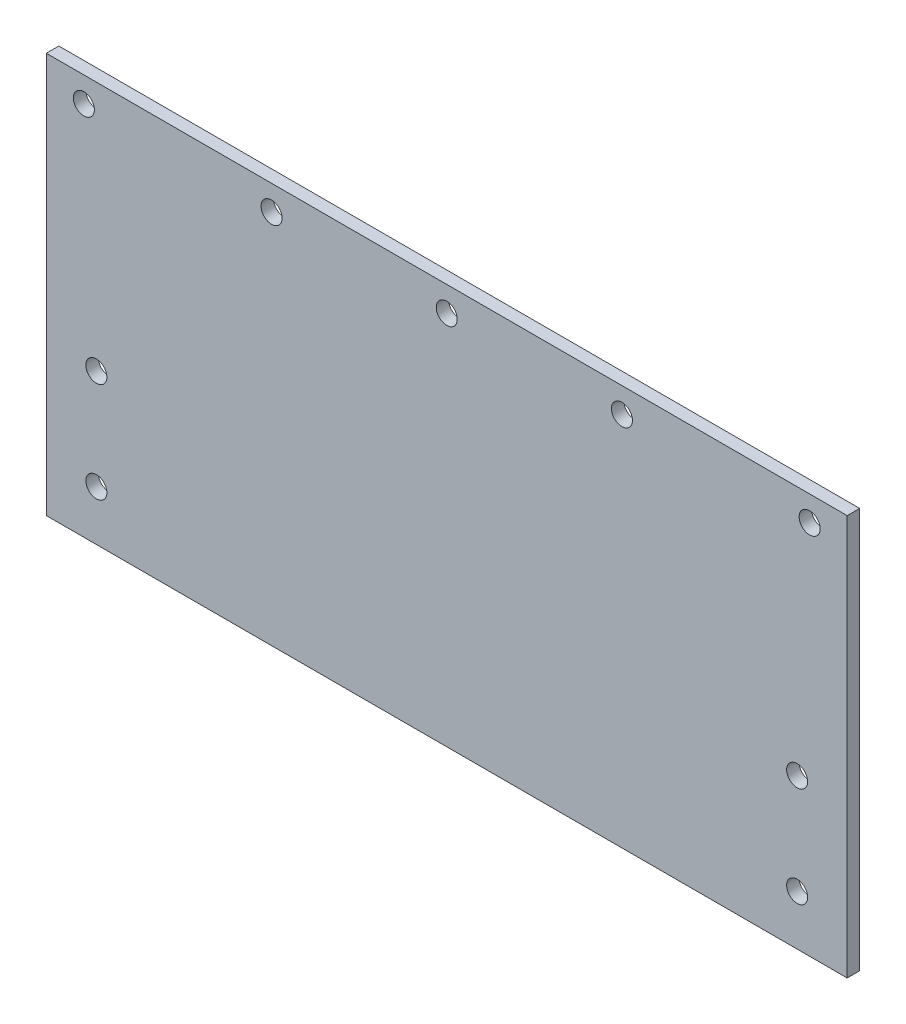
ISO-10303-21;
HEADER;
FILE_DESCRIPTION(('STEP AP214'),'2;1');
FILE_NAME('part.step','',(''),(''),'','','');
FILE_SCHEMA(('AUTOMOTIVE_DESIGN { 1 0 10303 214 1 1 1 1 }'));
ENDSEC;
DATA;
#1=APPLICATION_CONTEXT('core data for automotive mechanical design processes');
#2=APPLICATION_PROTOCOL_DEFINITION('international standard','automotive_design',2000,#1);
#3=PRODUCT_CONTEXT('',#1,'mechanical');
#4=PRODUCT('Part','Part','',(#3));
#5=PRODUCT_RELATED_PRODUCT_CATEGORY('part','',(#4));
#6=PRODUCT_DEFINITION_FORMATION('','',#4);
#7=PRODUCT_DEFINITION_CONTEXT('part definition',#1,'design');
#8=PRODUCT_DEFINITION('design','',#6,#7);
#9=PRODUCT_DEFINITION_SHAPE('','',#8);
#10=(LENGTH_UNIT() NAMED_UNIT(*) SI_UNIT(.MILLI.,.METRE.));
#11=(NAMED_UNIT(*) PLANE_ANGLE_UNIT() SI_UNIT($,.RADIAN.));
#12=(NAMED_UNIT(*) SI_UNIT($,.STERADIAN.) SOLID_ANGLE_UNIT());
#13=UNCERTAINTY_MEASURE_WITH_UNIT(LENGTH_MEASURE(1.E-05),#10,'distance_accuracy_value','');
#14=(GEOMETRIC_REPRESENTATION_CONTEXT(3) GLOBAL_UNCERTAINTY_ASSIGNED_CONTEXT((#13)) GLOBAL_UNIT_ASSIGNED_CONTEXT((#10,
#11,#12)) REPRESENTATION_CONTEXT('',''));
#15=CARTESIAN_POINT('',(0.,0.,0.));
#16=DIRECTION('',(0.,0.,1.));
#17=DIRECTION('',(1.,0.,0.));
#18=AXIS2_PLACEMENT_3D('',#15,#16,#17);
#19=CARTESIAN_POINT('',(160.,-80.,5.));
#20=DIRECTION('',(-1.,0.,0.));
#21=DIRECTION('',(0.,0.,1.));
#22=AXIS2_PLACEMENT_3D('',#19,#20,#21);
#23=PLANE('',#22);
#24=DIRECTION('',(0.,1.,0.));
#25=VECTOR('',#24,1.);
#26=CARTESIAN_POINT('',(160.,-80.,0.));
#27=LINE('',#26,#25);
#28=CARTESIAN_POINT('',(160.,-80.,0.));
#29=VERTEX_POINT('',#28);
#30=CARTESIAN_POINT('',(160.,80.,0.));
#31=VERTEX_POINT('',#30);
#32=EDGE_CURVE('E107',#29,#31,#27,.T.);
#33=ORIENTED_EDGE('',*,*,#32,.T.);
#34=DIRECTION('',(0.,0.,-1.));
#35=VECTOR('',#34,1.);
#36=CARTESIAN_POINT('',(160.,80.,5.));
#37=LINE('',#36,#35);
#38=CARTESIAN_POINT('',(160.,80.,5.));
#39=VERTEX_POINT('',#38);
#40=EDGE_CURVE('E11',#39,#31,#37,.T.);
#41=ORIENTED_EDGE('',*,*,#40,.F.);
#42=DIRECTION('',(0.,1.,0.));
#43=VECTOR('',#42,1.);
#44=CARTESIAN_POINT('',(160.,-80.,5.));
#45=LINE('',#44,#43);
#46=CARTESIAN_POINT('',(160.,-80.,5.));
#47=VERTEX_POINT('',#46);
#48=EDGE_CURVE('E89',#47,#39,#45,.T.);
#49=ORIENTED_EDGE('',*,*,#48,.F.);
#50=DIRECTION('',(0.,0.,-1.));
#51=VECTOR('',#50,1.);
#52=CARTESIAN_POINT('',(160.,-80.,5.));
#53=LINE('',#52,#51);
#54=EDGE_CURVE('E56',#47,#29,#53,.T.);
#55=ORIENTED_EDGE('',*,*,#54,.T.);
#56=EDGE_LOOP('',(#33,#41,#49,#55));
#57=FACE_BOUND('',#56,.T.);
#58=ADVANCED_FACE('F39',(#57),#23,.F.);
#59=CARTESIAN_POINT('',(160.,80.,5.));
#60=DIRECTION('',(0.,-1.,0.));
#61=DIRECTION('',(1.,0.,0.));
#62=AXIS2_PLACEMENT_3D('',#59,#60,#61);
#63=PLANE('',#62);
#64=DIRECTION('',(-1.,0.,0.));
#65=VECTOR('',#64,1.);
#66=CARTESIAN_POINT('',(160.,80.,0.));
#67=LINE('',#66,#65);
#68=CARTESIAN_POINT('',(-160.,80.,0.));
#69=VERTEX_POINT('',#68);
#70=EDGE_CURVE('E95',#31,#69,#67,.T.);
#71=ORIENTED_EDGE('',*,*,#70,.T.);
#72=DIRECTION('',(0.,0.,-1.));
#73=VECTOR('',#72,1.);
#74=CARTESIAN_POINT('',(-160.,80.,5.));
#75=LINE('',#74,#73);
#76=CARTESIAN_POINT('',(-160.,80.,5.));
#77=VERTEX_POINT('',#76);
#78=EDGE_CURVE('E48',#77,#69,#75,.T.);
#79=ORIENTED_EDGE('',*,*,#78,.F.);
#80=DIRECTION('',(-1.,0.,0.));
#81=VECTOR('',#80,1.);
#82=CARTESIAN_POINT('',(160.,80.,5.));
#83=LINE('',#82,#81);
#84=EDGE_CURVE('E81',#39,#77,#83,.T.);
#85=ORIENTED_EDGE('',*,*,#84,.F.);
#86=ORIENTED_EDGE('',*,*,#40,.T.);
#87=EDGE_LOOP('',(#71,#79,#85,#86));
#88=FACE_BOUND('',#87,.T.);
#89=ADVANCED_FACE('F94',(#88),#63,.F.);
#90=CARTESIAN_POINT('',(-160.,-80.,5.));
#91=DIRECTION('',(-1.,0.,0.));
#92=DIRECTION('',(0.,0.,1.));
#93=AXIS2_PLACEMENT_3D('',#90,#91,#92);
#94=PLANE('',#93);
#95=DIRECTION('',(0.,1.,0.));
#96=VECTOR('',#95,1.);
#97=CARTESIAN_POINT('',(-160.,-80.,0.));
#98=LINE('',#97,#96);
#99=CARTESIAN_POINT('',(-160.,-80.,0.));
#100=VERTEX_POINT('',#99);
#101=EDGE_CURVE('E113',#100,#69,#98,.T.);
#102=ORIENTED_EDGE('',*,*,#101,.F.);
#103=DIRECTION('',(0.,0.,-1.));
#104=VECTOR('',#103,1.);
#105=CARTESIAN_POINT('',(-160.,-80.,5.));
#106=LINE('',#105,#104);
#107=CARTESIAN_POINT('',(-160.,-80.,5.));
#108=VERTEX_POINT('',#107);
#109=EDGE_CURVE('E70',#108,#100,#106,.T.);
#110=ORIENTED_EDGE('',*,*,#109,.F.);
#111=DIRECTION('',(0.,1.,0.));
#112=VECTOR('',#111,1.);
#113=CARTESIAN_POINT('',(-160.,-80.,5.));
#114=LINE('',#113,#112);
#115=EDGE_CURVE('E88',#108,#77,#114,.T.);
#116=ORIENTED_EDGE('',*,*,#115,.T.);
#117=ORIENTED_EDGE('',*,*,#78,.T.);
#118=EDGE_LOOP('',(#102,#110,#116,#117));
#119=FACE_BOUND('',#118,.T.);
#120=ADVANCED_FACE('F99',(#119),#94,.T.);
#121=CARTESIAN_POINT('',(160.,-80.,5.));
#122=DIRECTION('',(0.,-1.,0.));
#123=DIRECTION('',(1.,0.,0.));
#124=AXIS2_PLACEMENT_3D('',#121,#122,#123);
#125=PLANE('',#124);
#126=DIRECTION('',(-1.,0.,0.));
#127=VECTOR('',#126,1.);
#128=CARTESIAN_POINT('',(160.,-80.,0.));
#129=LINE('',#128,#127);
#130=EDGE_CURVE('E116',#29,#100,#129,.T.);
#131=ORIENTED_EDGE('',*,*,#130,.F.);
#132=ORIENTED_EDGE('',*,*,#54,.F.);
#133=DIRECTION('',(-1.,0.,0.));
#134=VECTOR('',#133,1.);
#135=CARTESIAN_POINT('',(160.,-80.,5.));
#136=LINE('',#135,#134);
#137=EDGE_CURVE('E101',#47,#108,#136,.T.);
#138=ORIENTED_EDGE('',*,*,#137,.T.);
#139=ORIENTED_EDGE('',*,*,#109,.T.);
#140=EDGE_LOOP('',(#131,#132,#138,#139));
#141=FACE_BOUND('',#140,.T.);
#142=ADVANCED_FACE('F203',(#141),#125,.T.);
#143=CARTESIAN_POINT('',(0.,0.,5.));
#144=DIRECTION('',(0.,0.,1.));
#145=DIRECTION('',(1.,0.,0.));
#146=AXIS2_PLACEMENT_3D('',#143,#144,#145);
#147=PLANE('',#146);
#148=CARTESIAN_POINT('',(-145.,70.,5.));
#149=DIRECTION('',(0.,0.,1.));
#150=DIRECTION('',(1.,0.,0.));
#151=AXIS2_PLACEMENT_3D('',#148,#149,#150);
#152=CIRCLE('',#151,4.20000000000001);
#153=CARTESIAN_POINT('',(-140.8,70.,5.));
#154=VERTEX_POINT('',#153);
#155=EDGE_CURVE('E193',#154,#154,#152,.T.);
#156=ORIENTED_EDGE('',*,*,#155,.F.);
#157=EDGE_LOOP('',(#156));
#158=FACE_BOUND('',#157,.T.);
#159=CARTESIAN_POINT('',(-70.,70.,5.));
#160=DIRECTION('',(0.,0.,1.));
#161=DIRECTION('',(1.,0.,0.));
#162=AXIS2_PLACEMENT_3D('',#159,#160,#161);
#163=CIRCLE('',#162,4.2);
#164=CARTESIAN_POINT('',(-65.8000000000001,70.,5.));
#165=VERTEX_POINT('',#164);
#166=EDGE_CURVE('E185',#165,#165,#163,.T.);
#167=ORIENTED_EDGE('',*,*,#166,.F.);
#168=EDGE_LOOP('',(#167));
#169=FACE_BOUND('',#168,.T.);
#170=CARTESIAN_POINT('',(0.,70.,5.));
#171=DIRECTION('',(0.,0.,1.));
#172=DIRECTION('',(1.,0.,0.));
#173=AXIS2_PLACEMENT_3D('',#170,#171,#172);
#174=CIRCLE('',#173,4.2);
#175=CARTESIAN_POINT('',(4.2,70.,5.));
#176=VERTEX_POINT('',#175);
#177=EDGE_CURVE('E177',#176,#176,#174,.T.);
#178=ORIENTED_EDGE('',*,*,#177,.F.);
#179=EDGE_LOOP('',(#178));
#180=FACE_BOUND('',#179,.T.);
#181=CARTESIAN_POINT('',(70.,70.,5.));
#182=DIRECTION('',(0.,0.,1.));
#183=DIRECTION('',(1.,0.,0.));
#184=AXIS2_PLACEMENT_3D('',#181,#182,#183);
#185=CIRCLE('',#184,4.2);
#186=CARTESIAN_POINT('',(74.2,70.,5.));
#187=VERTEX_POINT('',#186);
#188=EDGE_CURVE('E169',#187,#187,#185,.T.);
#189=ORIENTED_EDGE('',*,*,#188,.F.);
#190=EDGE_LOOP('',(#189));
#191=FACE_BOUND('',#190,.T.);
#192=CARTESIAN_POINT('',(145.,70.,5.));
#193=DIRECTION('',(0.,0.,1.));
#194=DIRECTION('',(1.,0.,0.));
#195=AXIS2_PLACEMENT_3D('',#192,#193,#194);
#196=CIRCLE('',#195,4.20000000000001);
#197=CARTESIAN_POINT('',(149.2,70.,5.));
#198=VERTEX_POINT('',#197);
#199=EDGE_CURVE('E161',#198,#198,#196,.T.);
#200=ORIENTED_EDGE('',*,*,#199,.F.);
#201=EDGE_LOOP('',(#200));
#202=FACE_BOUND('',#201,.T.);
#203=CARTESIAN_POINT('',(-140.,-20.,5.));
#204=DIRECTION('',(0.,0.,1.));
#205=DIRECTION('',(1.,0.,0.));
#206=AXIS2_PLACEMENT_3D('',#203,#204,#205);
#207=CIRCLE('',#206,4.20000000000001);
#208=CARTESIAN_POINT('',(-135.8,-20.,5.));
#209=VERTEX_POINT('',#208);
#210=EDGE_CURVE('E153',#209,#209,#207,.T.);
#211=ORIENTED_EDGE('',*,*,#210,.F.);
#212=EDGE_LOOP('',(#211));
#213=FACE_BOUND('',#212,.T.);
#214=CARTESIAN_POINT('',(-140.,-60.,5.));
#215=DIRECTION('',(0.,0.,1.));
#216=DIRECTION('',(1.,0.,0.));
#217=AXIS2_PLACEMENT_3D('',#214,#215,#216);
#218=CIRCLE('',#217,4.20000000000001);
#219=CARTESIAN_POINT('',(-135.8,-60.,5.));
#220=VERTEX_POINT('',#219);
#221=EDGE_CURVE('E145',#220,#220,#218,.T.);
#222=ORIENTED_EDGE('',*,*,#221,.F.);
#223=EDGE_LOOP('',(#222));
#224=FACE_BOUND('',#223,.T.);
#225=CARTESIAN_POINT('',(140.,-20.,5.));
#226=DIRECTION('',(0.,0.,1.));
#227=DIRECTION('',(1.,0.,0.));
#228=AXIS2_PLACEMENT_3D('',#225,#226,#227);
#229=CIRCLE('',#228,4.20000000000001);
#230=CARTESIAN_POINT('',(144.2,-20.,5.));
#231=VERTEX_POINT('',#230);
#232=EDGE_CURVE('E137',#231,#231,#229,.T.);
#233=ORIENTED_EDGE('',*,*,#232,.F.);
#234=EDGE_LOOP('',(#233));
#235=FACE_BOUND('',#234,.T.);
#236=CARTESIAN_POINT('',(140.,-60.,5.));
#237=DIRECTION('',(0.,0.,1.));
#238=DIRECTION('',(1.,0.,0.));
#239=AXIS2_PLACEMENT_3D('',#236,#237,#238);
#240=CIRCLE('',#239,4.20000000000001);
#241=CARTESIAN_POINT('',(144.2,-60.,5.));
#242=VERTEX_POINT('',#241);
#243=EDGE_CURVE('E129',#242,#242,#240,.T.);
#244=ORIENTED_EDGE('',*,*,#243,.F.);
#245=EDGE_LOOP('',(#244));
#246=FACE_BOUND('',#245,.T.);
#247=ORIENTED_EDGE('',*,*,#48,.T.);
#248=ORIENTED_EDGE('',*,*,#84,.T.);
#249=ORIENTED_EDGE('',*,*,#115,.F.);
#250=ORIENTED_EDGE('',*,*,#137,.F.);
#251=EDGE_LOOP('',(#247,#248,#249,#250));
#252=FACE_BOUND('',#251,.T.);
#253=ADVANCED_FACE('F85',(#158,#169,#180,#191,#202,#213,#224,#235,#246,#252),#147,.T.);
#254=CARTESIAN_POINT('',(0.,0.,0.));
#255=DIRECTION('',(0.,0.,1.));
#256=DIRECTION('',(1.,0.,0.));
#257=AXIS2_PLACEMENT_3D('',#254,#255,#256);
#258=PLANE('',#257);
#259=CARTESIAN_POINT('',(-145.,70.,0.));
#260=DIRECTION('',(0.,0.,1.));
#261=DIRECTION('',(1.,0.,0.));
#262=AXIS2_PLACEMENT_3D('',#259,#260,#261);
#263=CIRCLE('',#262,4.20000000000001);
#264=CARTESIAN_POINT('',(-140.8,70.,0.));
#265=VERTEX_POINT('',#264);
#266=EDGE_CURVE('E189',#265,#265,#263,.T.);
#267=ORIENTED_EDGE('',*,*,#266,.T.);
#268=EDGE_LOOP('',(#267));
#269=FACE_BOUND('',#268,.T.);
#270=CARTESIAN_POINT('',(-70.,70.,0.));
#271=DIRECTION('',(0.,0.,1.));
#272=DIRECTION('',(1.,0.,0.));
#273=AXIS2_PLACEMENT_3D('',#270,#271,#272);
#274=CIRCLE('',#273,4.2);
#275=CARTESIAN_POINT('',(-65.8000000000001,70.,0.));
#276=VERTEX_POINT('',#275);
#277=EDGE_CURVE('E181',#276,#276,#274,.T.);
#278=ORIENTED_EDGE('',*,*,#277,.T.);
#279=EDGE_LOOP('',(#278));
#280=FACE_BOUND('',#279,.T.);
#281=CARTESIAN_POINT('',(0.,70.,0.));
#282=DIRECTION('',(0.,0.,1.));
#283=DIRECTION('',(1.,0.,0.));
#284=AXIS2_PLACEMENT_3D('',#281,#282,#283);
#285=CIRCLE('',#284,4.2);
#286=CARTESIAN_POINT('',(4.2,70.,0.));
#287=VERTEX_POINT('',#286);
#288=EDGE_CURVE('E173',#287,#287,#285,.T.);
#289=ORIENTED_EDGE('',*,*,#288,.T.);
#290=EDGE_LOOP('',(#289));
#291=FACE_BOUND('',#290,.T.);
#292=CARTESIAN_POINT('',(70.,70.,0.));
#293=DIRECTION('',(0.,0.,1.));
#294=DIRECTION('',(1.,0.,0.));
#295=AXIS2_PLACEMENT_3D('',#292,#293,#294);
#296=CIRCLE('',#295,4.2);
#297=CARTESIAN_POINT('',(74.2,70.,0.));
#298=VERTEX_POINT('',#297);
#299=EDGE_CURVE('E165',#298,#298,#296,.T.);
#300=ORIENTED_EDGE('',*,*,#299,.T.);
#301=EDGE_LOOP('',(#300));
#302=FACE_BOUND('',#301,.T.);
#303=CARTESIAN_POINT('',(145.,70.,0.));
#304=DIRECTION('',(0.,0.,1.));
#305=DIRECTION('',(1.,0.,0.));
#306=AXIS2_PLACEMENT_3D('',#303,#304,#305);
#307=CIRCLE('',#306,4.20000000000001);
#308=CARTESIAN_POINT('',(149.2,70.,0.));
#309=VERTEX_POINT('',#308);
#310=EDGE_CURVE('E157',#309,#309,#307,.T.);
#311=ORIENTED_EDGE('',*,*,#310,.T.);
#312=EDGE_LOOP('',(#311));
#313=FACE_BOUND('',#312,.T.);
#314=CARTESIAN_POINT('',(-140.,-20.,0.));
#315=DIRECTION('',(0.,0.,1.));
#316=DIRECTION('',(1.,0.,0.));
#317=AXIS2_PLACEMENT_3D('',#314,#315,#316);
#318=CIRCLE('',#317,4.20000000000001);
#319=CARTESIAN_POINT('',(-135.8,-20.,0.));
#320=VERTEX_POINT('',#319);
#321=EDGE_CURVE('E149',#320,#320,#318,.T.);
#322=ORIENTED_EDGE('',*,*,#321,.T.);
#323=EDGE_LOOP('',(#322));
#324=FACE_BOUND('',#323,.T.);
#325=CARTESIAN_POINT('',(-140.,-60.,0.));
#326=DIRECTION('',(0.,0.,1.));
#327=DIRECTION('',(1.,0.,0.));
#328=AXIS2_PLACEMENT_3D('',#325,#326,#327);
#329=CIRCLE('',#328,4.20000000000001);
#330=CARTESIAN_POINT('',(-135.8,-60.,0.));
#331=VERTEX_POINT('',#330);
#332=EDGE_CURVE('E141',#331,#331,#329,.T.);
#333=ORIENTED_EDGE('',*,*,#332,.T.);
#334=EDGE_LOOP('',(#333));
#335=FACE_BOUND('',#334,.T.);
#336=CARTESIAN_POINT('',(140.,-20.,0.));
#337=DIRECTION('',(0.,0.,1.));
#338=DIRECTION('',(1.,0.,0.));
#339=AXIS2_PLACEMENT_3D('',#336,#337,#338);
#340=CIRCLE('',#339,4.20000000000001);
#341=CARTESIAN_POINT('',(144.2,-20.,0.));
#342=VERTEX_POINT('',#341);
#343=EDGE_CURVE('E133',#342,#342,#340,.T.);
#344=ORIENTED_EDGE('',*,*,#343,.T.);
#345=EDGE_LOOP('',(#344));
#346=FACE_BOUND('',#345,.T.);
#347=CARTESIAN_POINT('',(140.,-60.,0.));
#348=DIRECTION('',(0.,0.,1.));
#349=DIRECTION('',(1.,0.,0.));
#350=AXIS2_PLACEMENT_3D('',#347,#348,#349);
#351=CIRCLE('',#350,4.20000000000001);
#352=CARTESIAN_POINT('',(144.2,-60.,0.));
#353=VERTEX_POINT('',#352);
#354=EDGE_CURVE('E110',#353,#353,#351,.T.);
#355=ORIENTED_EDGE('',*,*,#354,.T.);
#356=EDGE_LOOP('',(#355));
#357=FACE_BOUND('',#356,.T.);
#358=ORIENTED_EDGE('',*,*,#32,.F.);
#359=ORIENTED_EDGE('',*,*,#130,.T.);
#360=ORIENTED_EDGE('',*,*,#101,.T.);
#361=ORIENTED_EDGE('',*,*,#70,.F.);
#362=EDGE_LOOP('',(#358,#359,#360,#361));
#363=FACE_BOUND('',#362,.T.);
#364=ADVANCED_FACE('F202',(#269,#280,#291,#302,#313,#324,#335,#346,#357,#363),#258,.F.);
#365=CARTESIAN_POINT('',(140.,-60.,5.));
#366=DIRECTION('',(0.,0.,1.));
#367=DIRECTION('',(1.,0.,0.));
#368=AXIS2_PLACEMENT_3D('',#365,#366,#367);
#369=CYLINDRICAL_SURFACE('',#368,4.20000000000001);
#370=ORIENTED_EDGE('',*,*,#354,.F.);
#371=EDGE_LOOP('',(#370));
#372=FACE_BOUND('',#371,.T.);
#373=ORIENTED_EDGE('',*,*,#243,.T.);
#374=EDGE_LOOP('',(#373));
#375=FACE_BOUND('',#374,.T.);
#376=ADVANCED_FACE('F221',(#372,#375),#369,.F.);
#377=CARTESIAN_POINT('',(140.,-20.,5.));
#378=DIRECTION('',(0.,0.,1.));
#379=DIRECTION('',(1.,0.,0.));
#380=AXIS2_PLACEMENT_3D('',#377,#378,#379);
#381=CYLINDRICAL_SURFACE('',#380,4.20000000000001);
#382=ORIENTED_EDGE('',*,*,#343,.F.);
#383=EDGE_LOOP('',(#382));
#384=FACE_BOUND('',#383,.T.);
#385=ORIENTED_EDGE('',*,*,#232,.T.);
#386=EDGE_LOOP('',(#385));
#387=FACE_BOUND('',#386,.T.);
#388=ADVANCED_FACE('F223',(#384,#387),#381,.F.);
#389=CARTESIAN_POINT('',(-140.,-60.,5.));
#390=DIRECTION('',(0.,0.,1.));
#391=DIRECTION('',(1.,0.,0.));
#392=AXIS2_PLACEMENT_3D('',#389,#390,#391);
#393=CYLINDRICAL_SURFACE('',#392,4.20000000000001);
#394=ORIENTED_EDGE('',*,*,#332,.F.);
#395=EDGE_LOOP('',(#394));
#396=FACE_BOUND('',#395,.T.);
#397=ORIENTED_EDGE('',*,*,#221,.T.);
#398=EDGE_LOOP('',(#397));
#399=FACE_BOUND('',#398,.T.);
#400=ADVANCED_FACE('F230',(#396,#399),#393,.F.);
#401=CARTESIAN_POINT('',(-140.,-20.,5.));
#402=DIRECTION('',(0.,0.,1.));
#403=DIRECTION('',(1.,0.,0.));
#404=AXIS2_PLACEMENT_3D('',#401,#402,#403);
#405=CYLINDRICAL_SURFACE('',#404,4.20000000000001);
#406=ORIENTED_EDGE('',*,*,#321,.F.);
#407=EDGE_LOOP('',(#406));
#408=FACE_BOUND('',#407,.T.);
#409=ORIENTED_EDGE('',*,*,#210,.T.);
#410=EDGE_LOOP('',(#409));
#411=FACE_BOUND('',#410,.T.);
#412=ADVANCED_FACE('F291',(#408,#411),#405,.F.);
#413=CARTESIAN_POINT('',(145.,70.,5.));
#414=DIRECTION('',(0.,0.,1.));
#415=DIRECTION('',(1.,0.,0.));
#416=AXIS2_PLACEMENT_3D('',#413,#414,#415);
#417=CYLINDRICAL_SURFACE('',#416,4.20000000000001);
#418=ORIENTED_EDGE('',*,*,#310,.F.);
#419=EDGE_LOOP('',(#418));
#420=FACE_BOUND('',#419,.T.);
#421=ORIENTED_EDGE('',*,*,#199,.T.);
#422=EDGE_LOOP('',(#421));
#423=FACE_BOUND('',#422,.T.);
#424=ADVANCED_FACE('F300',(#420,#423),#417,.F.);
#425=CARTESIAN_POINT('',(70.,70.,5.));
#426=DIRECTION('',(0.,0.,1.));
#427=DIRECTION('',(1.,0.,0.));
#428=AXIS2_PLACEMENT_3D('',#425,#426,#427);
#429=CYLINDRICAL_SURFACE('',#428,4.2);
#430=ORIENTED_EDGE('',*,*,#299,.F.);
#431=EDGE_LOOP('',(#430));
#432=FACE_BOUND('',#431,.T.);
#433=ORIENTED_EDGE('',*,*,#188,.T.);
#434=EDGE_LOOP('',(#433));
#435=FACE_BOUND('',#434,.T.);
#436=ADVANCED_FACE('F309',(#432,#435),#429,.F.);
#437=CARTESIAN_POINT('',(0.,70.,5.));
#438=DIRECTION('',(0.,0.,1.));
#439=DIRECTION('',(1.,0.,0.));
#440=AXIS2_PLACEMENT_3D('',#437,#438,#439);
#441=CYLINDRICAL_SURFACE('',#440,4.2);
#442=ORIENTED_EDGE('',*,*,#288,.F.);
#443=EDGE_LOOP('',(#442));
#444=FACE_BOUND('',#443,.T.);
#445=ORIENTED_EDGE('',*,*,#177,.T.);
#446=EDGE_LOOP('',(#445));
#447=FACE_BOUND('',#446,.T.);
#448=ADVANCED_FACE('F318',(#444,#447),#441,.F.);
#449=CARTESIAN_POINT('',(-70.,70.,5.));
#450=DIRECTION('',(0.,0.,1.));
#451=DIRECTION('',(1.,0.,0.));
#452=AXIS2_PLACEMENT_3D('',#449,#450,#451);
#453=CYLINDRICAL_SURFACE('',#452,4.2);
#454=ORIENTED_EDGE('',*,*,#277,.F.);
#455=EDGE_LOOP('',(#454));
#456=FACE_BOUND('',#455,.T.);
#457=ORIENTED_EDGE('',*,*,#166,.T.);
#458=EDGE_LOOP('',(#457));
#459=FACE_BOUND('',#458,.T.);
#460=ADVANCED_FACE('F327',(#456,#459),#453,.F.);
#461=CARTESIAN_POINT('',(-145.,70.,5.));
#462=DIRECTION('',(0.,0.,1.));
#463=DIRECTION('',(1.,0.,0.));
#464=AXIS2_PLACEMENT_3D('',#461,#462,#463);
#465=CYLINDRICAL_SURFACE('',#464,4.20000000000001);
#466=ORIENTED_EDGE('',*,*,#266,.F.);
#467=EDGE_LOOP('',(#466));
#468=FACE_BOUND('',#467,.T.);
#469=ORIENTED_EDGE('',*,*,#155,.T.);
#470=EDGE_LOOP('',(#469));
#471=FACE_BOUND('',#470,.T.);
#472=ADVANCED_FACE('F198',(#468,#471),#465,.F.);
#473=CLOSED_SHELL('',(#58,#89,#120,#142,#253,#364,#376,#388,#400,#412,#424,#436,#448,#460,#472));
#474=MANIFOLD_SOLID_BREP('B2',#473);
#475=ADVANCED_BREP_SHAPE_REPRESENTATION('',(#18,#474),#14);
#476=SHAPE_DEFINITION_REPRESENTATION(#9,#475);
ENDSEC;
END-ISO-10303-21;
